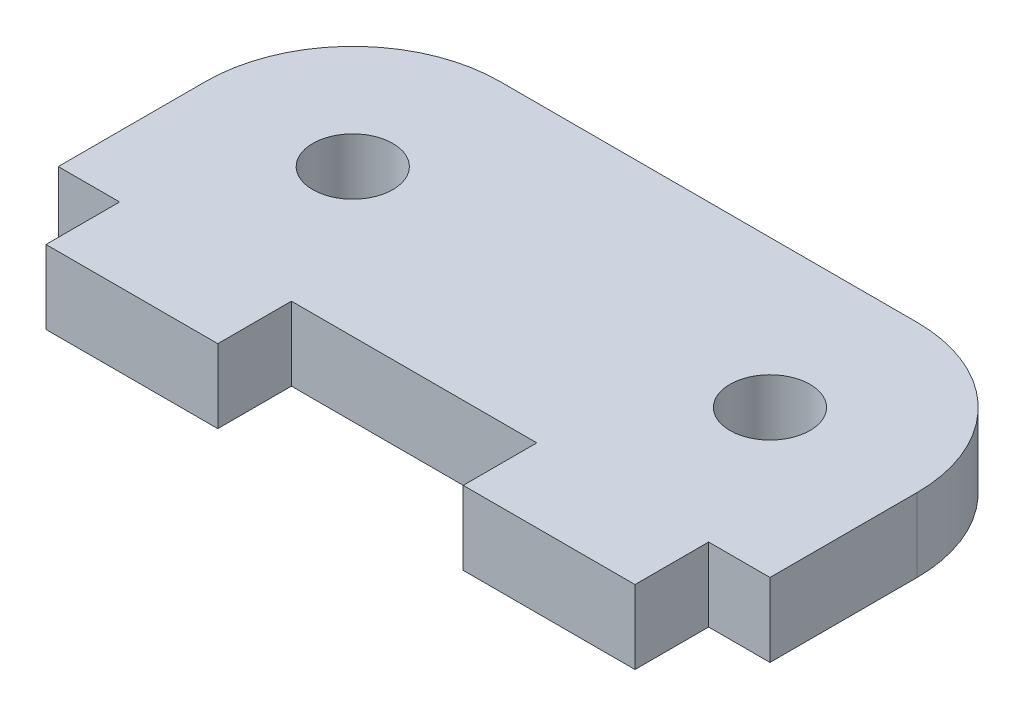
ISO-10303-21;
HEADER;
FILE_DESCRIPTION(('STEP AP214'),'2;1');
FILE_NAME('part.step','',(''),(''),'','','');
FILE_SCHEMA(('AUTOMOTIVE_DESIGN { 1 0 10303 214 1 1 1 1 }'));
ENDSEC;
DATA;
#1=APPLICATION_CONTEXT('core data for automotive mechanical design processes');
#2=APPLICATION_PROTOCOL_DEFINITION('international standard','automotive_design',2000,#1);
#3=PRODUCT_CONTEXT('',#1,'mechanical');
#4=PRODUCT('Part','Part','',(#3));
#5=PRODUCT_RELATED_PRODUCT_CATEGORY('part','',(#4));
#6=PRODUCT_DEFINITION_FORMATION('','',#4);
#7=PRODUCT_DEFINITION_CONTEXT('part definition',#1,'design');
#8=PRODUCT_DEFINITION('design','',#6,#7);
#9=PRODUCT_DEFINITION_SHAPE('','',#8);
#10=(LENGTH_UNIT() NAMED_UNIT(*) SI_UNIT(.MILLI.,.METRE.));
#11=(NAMED_UNIT(*) PLANE_ANGLE_UNIT() SI_UNIT($,.RADIAN.));
#12=(NAMED_UNIT(*) SI_UNIT($,.STERADIAN.) SOLID_ANGLE_UNIT());
#13=UNCERTAINTY_MEASURE_WITH_UNIT(LENGTH_MEASURE(1.E-05),#10,'distance_accuracy_value','');
#14=(GEOMETRIC_REPRESENTATION_CONTEXT(3) GLOBAL_UNCERTAINTY_ASSIGNED_CONTEXT((#13)) GLOBAL_UNIT_ASSIGNED_CONTEXT((#10,
#11,#12)) REPRESENTATION_CONTEXT('',''));
#15=CARTESIAN_POINT('',(0.,0.,0.));
#16=DIRECTION('',(0.,0.,1.));
#17=DIRECTION('',(1.,0.,0.));
#18=AXIS2_PLACEMENT_3D('',#15,#16,#17);
#19=CARTESIAN_POINT('',(0.,3.,-15.));
#20=DIRECTION('',(0.,0.,-1.));
#21=DIRECTION('',(-1.,0.,0.));
#22=AXIS2_PLACEMENT_3D('',#19,#20,#21);
#23=PLANE('',#22);
#24=DIRECTION('',(1.,0.,0.));
#25=VECTOR('',#24,1.);
#26=CARTESIAN_POINT('',(0.,0.,-15.));
#27=LINE('',#26,#25);
#28=CARTESIAN_POINT('',(3.49999999999999,0.,-15.));
#29=VERTEX_POINT('',#28);
#30=CARTESIAN_POINT('',(20.5,0.,-15.));
#31=VERTEX_POINT('',#30);
#32=EDGE_CURVE('E177',#29,#31,#27,.T.);
#33=ORIENTED_EDGE('',*,*,#32,.F.);
#34=DIRECTION('',(0.,-1.,0.));
#35=VECTOR('',#34,1.);
#36=CARTESIAN_POINT('',(3.49999999999999,3.,-15.));
#37=LINE('',#36,#35);
#38=CARTESIAN_POINT('',(3.49999999999999,3.,-15.));
#39=VERTEX_POINT('',#38);
#40=EDGE_CURVE('E11',#39,#29,#37,.T.);
#41=ORIENTED_EDGE('',*,*,#40,.F.);
#42=DIRECTION('',(1.,0.,0.));
#43=VECTOR('',#42,1.);
#44=CARTESIAN_POINT('',(0.,3.,-15.));
#45=LINE('',#44,#43);
#46=CARTESIAN_POINT('',(20.5,3.,-15.));
#47=VERTEX_POINT('',#46);
#48=EDGE_CURVE('E225',#39,#47,#45,.T.);
#49=ORIENTED_EDGE('',*,*,#48,.T.);
#50=DIRECTION('',(0.,-1.,0.));
#51=VECTOR('',#50,1.);
#52=CARTESIAN_POINT('',(20.5,3.,-15.));
#53=LINE('',#52,#51);
#54=EDGE_CURVE('E58',#47,#31,#53,.T.);
#55=ORIENTED_EDGE('',*,*,#54,.T.);
#56=EDGE_LOOP('',(#33,#41,#49,#55));
#57=FACE_BOUND('',#56,.T.);
#58=ADVANCED_FACE('F41',(#57),#23,.T.);
#59=CARTESIAN_POINT('',(3.5,3.,-9.));
#60=DIRECTION('',(0.,-1.,0.));
#61=DIRECTION('',(0.,0.,-1.));
#62=AXIS2_PLACEMENT_3D('',#59,#60,#61);
#63=CYLINDRICAL_SURFACE('',#62,6.);
#64=CARTESIAN_POINT('',(3.5,0.,-9.));
#65=DIRECTION('',(0.,1.,0.));
#66=DIRECTION('',(0.,0.,1.));
#67=AXIS2_PLACEMENT_3D('',#64,#65,#66);
#68=CIRCLE('',#67,6.);
#69=CARTESIAN_POINT('',(-2.5,0.,-9.));
#70=VERTEX_POINT('',#69);
#71=EDGE_CURVE('E180',#70,#29,#68,.F.);
#72=ORIENTED_EDGE('',*,*,#71,.F.);
#73=DIRECTION('',(0.,-1.,0.));
#74=VECTOR('',#73,1.);
#75=CARTESIAN_POINT('',(-2.5,3.,-9.));
#76=LINE('',#75,#74);
#77=CARTESIAN_POINT('',(-2.5,3.,-9.));
#78=VERTEX_POINT('',#77);
#79=EDGE_CURVE('E50',#78,#70,#76,.T.);
#80=ORIENTED_EDGE('',*,*,#79,.F.);
#81=CARTESIAN_POINT('',(3.5,3.,-9.));
#82=DIRECTION('',(0.,1.,0.));
#83=DIRECTION('',(0.,0.,1.));
#84=AXIS2_PLACEMENT_3D('',#81,#82,#83);
#85=CIRCLE('',#84,6.);
#86=EDGE_CURVE('E285',#78,#39,#85,.F.);
#87=ORIENTED_EDGE('',*,*,#86,.T.);
#88=ORIENTED_EDGE('',*,*,#40,.T.);
#89=EDGE_LOOP('',(#72,#80,#87,#88));
#90=FACE_BOUND('',#89,.T.);
#91=ADVANCED_FACE('F269',(#90),#63,.T.);
#92=CARTESIAN_POINT('',(-2.5,3.,0.));
#93=DIRECTION('',(-1.,0.,0.));
#94=DIRECTION('',(0.,0.,1.));
#95=AXIS2_PLACEMENT_3D('',#92,#93,#94);
#96=PLANE('',#95);
#97=DIRECTION('',(0.,0.,-1.));
#98=VECTOR('',#97,1.);
#99=CARTESIAN_POINT('',(-2.5,0.,0.));
#100=LINE('',#99,#98);
#101=CARTESIAN_POINT('',(-2.5,0.,-3.));
#102=VERTEX_POINT('',#101);
#103=EDGE_CURVE('E185',#102,#70,#100,.T.);
#104=ORIENTED_EDGE('',*,*,#103,.F.);
#105=DIRECTION('',(0.,-1.,0.));
#106=VECTOR('',#105,1.);
#107=CARTESIAN_POINT('',(-2.5,3.,-3.));
#108=LINE('',#107,#106);
#109=CARTESIAN_POINT('',(-2.5,3.,-3.));
#110=VERTEX_POINT('',#109);
#111=EDGE_CURVE('E256',#110,#102,#108,.T.);
#112=ORIENTED_EDGE('',*,*,#111,.F.);
#113=DIRECTION('',(0.,0.,-1.));
#114=VECTOR('',#113,1.);
#115=CARTESIAN_POINT('',(-2.5,3.,0.));
#116=LINE('',#115,#114);
#117=EDGE_CURVE('E265',#110,#78,#116,.T.);
#118=ORIENTED_EDGE('',*,*,#117,.T.);
#119=ORIENTED_EDGE('',*,*,#79,.T.);
#120=EDGE_LOOP('',(#104,#112,#118,#119));
#121=FACE_BOUND('',#120,.T.);
#122=ADVANCED_FACE('F263',(#121),#96,.T.);
#123=CARTESIAN_POINT('',(0.,3.,-3.));
#124=DIRECTION('',(0.,0.,-1.));
#125=DIRECTION('',(-1.,0.,0.));
#126=AXIS2_PLACEMENT_3D('',#123,#124,#125);
#127=PLANE('',#126);
#128=DIRECTION('',(1.,0.,0.));
#129=VECTOR('',#128,1.);
#130=CARTESIAN_POINT('',(0.,0.,-3.));
#131=LINE('',#130,#129);
#132=CARTESIAN_POINT('',(0.,0.,-3.));
#133=VERTEX_POINT('',#132);
#134=EDGE_CURVE('E189',#102,#133,#131,.T.);
#135=ORIENTED_EDGE('',*,*,#134,.T.);
#136=DIRECTION('',(0.,-1.,0.));
#137=VECTOR('',#136,1.);
#138=CARTESIAN_POINT('',(0.,3.,-3.));
#139=LINE('',#138,#137);
#140=CARTESIAN_POINT('',(0.,3.,-3.));
#141=VERTEX_POINT('',#140);
#142=EDGE_CURVE('E253',#141,#133,#139,.T.);
#143=ORIENTED_EDGE('',*,*,#142,.F.);
#144=DIRECTION('',(1.,0.,0.));
#145=VECTOR('',#144,1.);
#146=CARTESIAN_POINT('',(0.,3.,-3.));
#147=LINE('',#146,#145);
#148=EDGE_CURVE('E280',#110,#141,#147,.T.);
#149=ORIENTED_EDGE('',*,*,#148,.F.);
#150=ORIENTED_EDGE('',*,*,#111,.T.);
#151=EDGE_LOOP('',(#135,#143,#149,#150));
#152=FACE_BOUND('',#151,.T.);
#153=ADVANCED_FACE('F277',(#152),#127,.F.);
#154=CARTESIAN_POINT('',(0.,3.,0.));
#155=DIRECTION('',(-1.,0.,0.));
#156=DIRECTION('',(0.,0.,1.));
#157=AXIS2_PLACEMENT_3D('',#154,#155,#156);
#158=PLANE('',#157);
#159=DIRECTION('',(0.,0.,-1.));
#160=VECTOR('',#159,1.);
#161=CARTESIAN_POINT('',(0.,0.,0.));
#162=LINE('',#161,#160);
#163=CARTESIAN_POINT('',(0.,0.,0.));
#164=VERTEX_POINT('',#163);
#165=EDGE_CURVE('E193',#164,#133,#162,.T.);
#166=ORIENTED_EDGE('',*,*,#165,.F.);
#167=DIRECTION('',(0.,-1.,0.));
#168=VECTOR('',#167,1.);
#169=CARTESIAN_POINT('',(0.,3.,0.));
#170=LINE('',#169,#168);
#171=CARTESIAN_POINT('',(0.,3.,0.));
#172=VERTEX_POINT('',#171);
#173=EDGE_CURVE('E250',#172,#164,#170,.T.);
#174=ORIENTED_EDGE('',*,*,#173,.F.);
#175=DIRECTION('',(0.,0.,-1.));
#176=VECTOR('',#175,1.);
#177=CARTESIAN_POINT('',(0.,3.,0.));
#178=LINE('',#177,#176);
#179=EDGE_CURVE('E283',#172,#141,#178,.T.);
#180=ORIENTED_EDGE('',*,*,#179,.T.);
#181=ORIENTED_EDGE('',*,*,#142,.T.);
#182=EDGE_LOOP('',(#166,#174,#180,#181));
#183=FACE_BOUND('',#182,.T.);
#184=ADVANCED_FACE('F353',(#183),#158,.T.);
#185=CARTESIAN_POINT('',(0.,3.,0.));
#186=DIRECTION('',(0.,0.,-1.));
#187=DIRECTION('',(-1.,0.,0.));
#188=AXIS2_PLACEMENT_3D('',#185,#186,#187);
#189=PLANE('',#188);
#190=DIRECTION('',(1.,0.,0.));
#191=VECTOR('',#190,1.);
#192=CARTESIAN_POINT('',(0.,0.,0.));
#193=LINE('',#192,#191);
#194=CARTESIAN_POINT('',(7.,0.,0.));
#195=VERTEX_POINT('',#194);
#196=EDGE_CURVE('E197',#164,#195,#193,.T.);
#197=ORIENTED_EDGE('',*,*,#196,.T.);
#198=DIRECTION('',(0.,-1.,0.));
#199=VECTOR('',#198,1.);
#200=CARTESIAN_POINT('',(7.,3.,0.));
#201=LINE('',#200,#199);
#202=CARTESIAN_POINT('',(7.,3.,0.));
#203=VERTEX_POINT('',#202);
#204=EDGE_CURVE('E246',#203,#195,#201,.T.);
#205=ORIENTED_EDGE('',*,*,#204,.F.);
#206=DIRECTION('',(1.,0.,0.));
#207=VECTOR('',#206,1.);
#208=CARTESIAN_POINT('',(0.,3.,0.));
#209=LINE('',#208,#207);
#210=EDGE_CURVE('E294',#172,#203,#209,.T.);
#211=ORIENTED_EDGE('',*,*,#210,.F.);
#212=ORIENTED_EDGE('',*,*,#173,.T.);
#213=EDGE_LOOP('',(#197,#205,#211,#212));
#214=FACE_BOUND('',#213,.T.);
#215=ADVANCED_FACE('F356',(#214),#189,.F.);
#216=CARTESIAN_POINT('',(7.,3.,0.));
#217=DIRECTION('',(-1.,0.,0.));
#218=DIRECTION('',(0.,0.,1.));
#219=AXIS2_PLACEMENT_3D('',#216,#217,#218);
#220=PLANE('',#219);
#221=DIRECTION('',(0.,0.,-1.));
#222=VECTOR('',#221,1.);
#223=CARTESIAN_POINT('',(7.,0.,0.));
#224=LINE('',#223,#222);
#225=CARTESIAN_POINT('',(7.,0.,-3.));
#226=VERTEX_POINT('',#225);
#227=EDGE_CURVE('E200',#195,#226,#224,.T.);
#228=ORIENTED_EDGE('',*,*,#227,.T.);
#229=DIRECTION('',(0.,-1.,0.));
#230=VECTOR('',#229,1.);
#231=CARTESIAN_POINT('',(7.,3.,-3.));
#232=LINE('',#231,#230);
#233=CARTESIAN_POINT('',(7.,3.,-3.));
#234=VERTEX_POINT('',#233);
#235=EDGE_CURVE('E242',#234,#226,#232,.T.);
#236=ORIENTED_EDGE('',*,*,#235,.F.);
#237=DIRECTION('',(0.,0.,-1.));
#238=VECTOR('',#237,1.);
#239=CARTESIAN_POINT('',(7.,3.,0.));
#240=LINE('',#239,#238);
#241=EDGE_CURVE('E297',#203,#234,#240,.T.);
#242=ORIENTED_EDGE('',*,*,#241,.F.);
#243=ORIENTED_EDGE('',*,*,#204,.T.);
#244=EDGE_LOOP('',(#228,#236,#242,#243));
#245=FACE_BOUND('',#244,.T.);
#246=ADVANCED_FACE('F360',(#245),#220,.F.);
#247=CARTESIAN_POINT('',(0.,3.,-3.));
#248=DIRECTION('',(0.,0.,-1.));
#249=DIRECTION('',(-1.,0.,0.));
#250=AXIS2_PLACEMENT_3D('',#247,#248,#249);
#251=PLANE('',#250);
#252=DIRECTION('',(1.,0.,0.));
#253=VECTOR('',#252,1.);
#254=CARTESIAN_POINT('',(0.,0.,-3.));
#255=LINE('',#254,#253);
#256=CARTESIAN_POINT('',(17.,0.,-3.));
#257=VERTEX_POINT('',#256);
#258=EDGE_CURVE('E203',#226,#257,#255,.T.);
#259=ORIENTED_EDGE('',*,*,#258,.T.);
#260=DIRECTION('',(0.,-1.,0.));
#261=VECTOR('',#260,1.);
#262=CARTESIAN_POINT('',(17.,3.,-3.));
#263=LINE('',#262,#261);
#264=CARTESIAN_POINT('',(17.,3.,-3.));
#265=VERTEX_POINT('',#264);
#266=EDGE_CURVE('E238',#265,#257,#263,.T.);
#267=ORIENTED_EDGE('',*,*,#266,.F.);
#268=DIRECTION('',(1.,0.,0.));
#269=VECTOR('',#268,1.);
#270=CARTESIAN_POINT('',(0.,3.,-3.));
#271=LINE('',#270,#269);
#272=EDGE_CURVE('E157',#234,#265,#271,.T.);
#273=ORIENTED_EDGE('',*,*,#272,.F.);
#274=ORIENTED_EDGE('',*,*,#235,.T.);
#275=EDGE_LOOP('',(#259,#267,#273,#274));
#276=FACE_BOUND('',#275,.T.);
#277=ADVANCED_FACE('F364',(#276),#251,.F.);
#278=CARTESIAN_POINT('',(17.,3.,0.));
#279=DIRECTION('',(1.,0.,0.));
#280=DIRECTION('',(0.,0.,-1.));
#281=AXIS2_PLACEMENT_3D('',#278,#279,#280);
#282=PLANE('',#281);
#283=DIRECTION('',(0.,0.,1.));
#284=VECTOR('',#283,1.);
#285=CARTESIAN_POINT('',(17.,0.,0.));
#286=LINE('',#285,#284);
#287=CARTESIAN_POINT('',(17.,0.,0.));
#288=VERTEX_POINT('',#287);
#289=EDGE_CURVE('E206',#257,#288,#286,.T.);
#290=ORIENTED_EDGE('',*,*,#289,.T.);
#291=DIRECTION('',(0.,-1.,0.));
#292=VECTOR('',#291,1.);
#293=CARTESIAN_POINT('',(17.,3.,0.));
#294=LINE('',#293,#292);
#295=CARTESIAN_POINT('',(17.,3.,0.));
#296=VERTEX_POINT('',#295);
#297=EDGE_CURVE('E235',#296,#288,#294,.T.);
#298=ORIENTED_EDGE('',*,*,#297,.F.);
#299=DIRECTION('',(0.,0.,1.));
#300=VECTOR('',#299,1.);
#301=CARTESIAN_POINT('',(17.,3.,0.));
#302=LINE('',#301,#300);
#303=EDGE_CURVE('E301',#265,#296,#302,.T.);
#304=ORIENTED_EDGE('',*,*,#303,.F.);
#305=ORIENTED_EDGE('',*,*,#266,.T.);
#306=EDGE_LOOP('',(#290,#298,#304,#305));
#307=FACE_BOUND('',#306,.T.);
#308=ADVANCED_FACE('F366',(#307),#282,.F.);
#309=CARTESIAN_POINT('',(0.,3.,0.));
#310=DIRECTION('',(0.,0.,1.));
#311=DIRECTION('',(1.,0.,0.));
#312=AXIS2_PLACEMENT_3D('',#309,#310,#311);
#313=PLANE('',#312);
#314=DIRECTION('',(-1.,0.,0.));
#315=VECTOR('',#314,1.);
#316=CARTESIAN_POINT('',(0.,0.,0.));
#317=LINE('',#316,#315);
#318=CARTESIAN_POINT('',(24.,0.,0.));
#319=VERTEX_POINT('',#318);
#320=EDGE_CURVE('E210',#319,#288,#317,.T.);
#321=ORIENTED_EDGE('',*,*,#320,.F.);
#322=DIRECTION('',(0.,-1.,0.));
#323=VECTOR('',#322,1.);
#324=CARTESIAN_POINT('',(24.,3.,0.));
#325=LINE('',#324,#323);
#326=CARTESIAN_POINT('',(24.,3.,0.));
#327=VERTEX_POINT('',#326);
#328=EDGE_CURVE('E232',#327,#319,#325,.T.);
#329=ORIENTED_EDGE('',*,*,#328,.F.);
#330=DIRECTION('',(-1.,0.,0.));
#331=VECTOR('',#330,1.);
#332=CARTESIAN_POINT('',(0.,3.,0.));
#333=LINE('',#332,#331);
#334=EDGE_CURVE('E303',#327,#296,#333,.T.);
#335=ORIENTED_EDGE('',*,*,#334,.T.);
#336=ORIENTED_EDGE('',*,*,#297,.T.);
#337=EDGE_LOOP('',(#321,#329,#335,#336));
#338=FACE_BOUND('',#337,.T.);
#339=ADVANCED_FACE('F369',(#338),#313,.T.);
#340=CARTESIAN_POINT('',(24.,3.,0.));
#341=DIRECTION('',(1.,0.,0.));
#342=DIRECTION('',(0.,0.,-1.));
#343=AXIS2_PLACEMENT_3D('',#340,#341,#342);
#344=PLANE('',#343);
#345=DIRECTION('',(0.,0.,1.));
#346=VECTOR('',#345,1.);
#347=CARTESIAN_POINT('',(24.,0.,0.));
#348=LINE('',#347,#346);
#349=CARTESIAN_POINT('',(24.,0.,-3.));
#350=VERTEX_POINT('',#349);
#351=EDGE_CURVE('E214',#350,#319,#348,.T.);
#352=ORIENTED_EDGE('',*,*,#351,.F.);
#353=DIRECTION('',(0.,-1.,0.));
#354=VECTOR('',#353,1.);
#355=CARTESIAN_POINT('',(24.,3.,-3.));
#356=LINE('',#355,#354);
#357=CARTESIAN_POINT('',(24.,3.,-3.));
#358=VERTEX_POINT('',#357);
#359=EDGE_CURVE('E166',#358,#350,#356,.T.);
#360=ORIENTED_EDGE('',*,*,#359,.F.);
#361=DIRECTION('',(0.,0.,1.));
#362=VECTOR('',#361,1.);
#363=CARTESIAN_POINT('',(24.,3.,0.));
#364=LINE('',#363,#362);
#365=EDGE_CURVE('E153',#358,#327,#364,.T.);
#366=ORIENTED_EDGE('',*,*,#365,.T.);
#367=ORIENTED_EDGE('',*,*,#328,.T.);
#368=EDGE_LOOP('',(#352,#360,#366,#367));
#369=FACE_BOUND('',#368,.T.);
#370=ADVANCED_FACE('F310',(#369),#344,.T.);
#371=CARTESIAN_POINT('',(26.5,0.,-3.));
#372=VERTEX_POINT('',#371);
#373=EDGE_CURVE('E162',#350,#372,#255,.T.);
#374=ORIENTED_EDGE('',*,*,#373,.T.);
#375=DIRECTION('',(0.,-1.,0.));
#376=VECTOR('',#375,1.);
#377=CARTESIAN_POINT('',(26.5,3.,-3.));
#378=LINE('',#377,#376);
#379=CARTESIAN_POINT('',(26.5,3.,-3.));
#380=VERTEX_POINT('',#379);
#381=EDGE_CURVE('E159',#380,#372,#378,.T.);
#382=ORIENTED_EDGE('',*,*,#381,.F.);
#383=EDGE_CURVE('E145',#358,#380,#271,.T.);
#384=ORIENTED_EDGE('',*,*,#383,.F.);
#385=ORIENTED_EDGE('',*,*,#359,.T.);
#386=EDGE_LOOP('',(#374,#382,#384,#385));
#387=FACE_BOUND('',#386,.T.);
#388=ADVANCED_FACE('F160',(#387),#251,.F.);
#389=CARTESIAN_POINT('',(26.5,3.,0.));
#390=DIRECTION('',(-1.,0.,0.));
#391=DIRECTION('',(0.,0.,1.));
#392=AXIS2_PLACEMENT_3D('',#389,#390,#391);
#393=PLANE('',#392);
#394=DIRECTION('',(0.,0.,-1.));
#395=VECTOR('',#394,1.);
#396=CARTESIAN_POINT('',(26.5,0.,0.));
#397=LINE('',#396,#395);
#398=CARTESIAN_POINT('',(26.5,0.,-9.));
#399=VERTEX_POINT('',#398);
#400=EDGE_CURVE('E218',#372,#399,#397,.T.);
#401=ORIENTED_EDGE('',*,*,#400,.T.);
#402=DIRECTION('',(0.,-1.,0.));
#403=VECTOR('',#402,1.);
#404=CARTESIAN_POINT('',(26.5,3.,-9.));
#405=LINE('',#404,#403);
#406=CARTESIAN_POINT('',(26.5,3.,-9.));
#407=VERTEX_POINT('',#406);
#408=EDGE_CURVE('E102',#407,#399,#405,.T.);
#409=ORIENTED_EDGE('',*,*,#408,.F.);
#410=DIRECTION('',(0.,0.,-1.));
#411=VECTOR('',#410,1.);
#412=CARTESIAN_POINT('',(26.5,3.,0.));
#413=LINE('',#412,#411);
#414=EDGE_CURVE('E150',#380,#407,#413,.T.);
#415=ORIENTED_EDGE('',*,*,#414,.F.);
#416=ORIENTED_EDGE('',*,*,#381,.T.);
#417=EDGE_LOOP('',(#401,#409,#415,#416));
#418=FACE_BOUND('',#417,.T.);
#419=ADVANCED_FACE('F168',(#418),#393,.F.);
#420=CARTESIAN_POINT('',(20.5,3.,-9.));
#421=DIRECTION('',(0.,-1.,0.));
#422=DIRECTION('',(0.,0.,-1.));
#423=AXIS2_PLACEMENT_3D('',#420,#421,#422);
#424=CYLINDRICAL_SURFACE('',#423,6.);
#425=CARTESIAN_POINT('',(20.5,0.,-9.));
#426=DIRECTION('',(0.,1.,0.));
#427=DIRECTION('',(0.,0.,1.));
#428=AXIS2_PLACEMENT_3D('',#425,#426,#427);
#429=CIRCLE('',#428,6.);
#430=EDGE_CURVE('E221',#31,#399,#429,.F.);
#431=ORIENTED_EDGE('',*,*,#430,.F.);
#432=ORIENTED_EDGE('',*,*,#54,.F.);
#433=CARTESIAN_POINT('',(20.5,3.,-9.));
#434=DIRECTION('',(0.,1.,0.));
#435=DIRECTION('',(0.,0.,1.));
#436=AXIS2_PLACEMENT_3D('',#433,#434,#435);
#437=CIRCLE('',#436,6.);
#438=EDGE_CURVE('E170',#47,#407,#437,.F.);
#439=ORIENTED_EDGE('',*,*,#438,.T.);
#440=ORIENTED_EDGE('',*,*,#408,.T.);
#441=EDGE_LOOP('',(#431,#432,#439,#440));
#442=FACE_BOUND('',#441,.T.);
#443=ADVANCED_FACE('F331',(#442),#424,.T.);
#444=CARTESIAN_POINT('',(0.,3.,0.));
#445=DIRECTION('',(0.,1.,0.));
#446=DIRECTION('',(0.,0.,1.));
#447=AXIS2_PLACEMENT_3D('',#444,#445,#446);
#448=PLANE('',#447);
#449=CARTESIAN_POINT('',(3.5,3.,-9.));
#450=DIRECTION('',(0.,1.,0.));
#451=DIRECTION('',(0.,0.,1.));
#452=AXIS2_PLACEMENT_3D('',#449,#450,#451);
#453=CIRCLE('',#452,1.63195);
#454=CARTESIAN_POINT('',(3.5,3.,-7.36805));
#455=VERTEX_POINT('',#454);
#456=EDGE_CURVE('E324',#455,#455,#453,.T.);
#457=ORIENTED_EDGE('',*,*,#456,.F.);
#458=EDGE_LOOP('',(#457));
#459=FACE_BOUND('',#458,.T.);
#460=CARTESIAN_POINT('',(20.5,3.,-9.));
#461=DIRECTION('',(0.,1.,0.));
#462=DIRECTION('',(0.,0.,1.));
#463=AXIS2_PLACEMENT_3D('',#460,#461,#462);
#464=CIRCLE('',#463,1.63195);
#465=CARTESIAN_POINT('',(20.5,3.,-7.36805));
#466=VERTEX_POINT('',#465);
#467=EDGE_CURVE('E316',#466,#466,#464,.T.);
#468=ORIENTED_EDGE('',*,*,#467,.F.);
#469=EDGE_LOOP('',(#468));
#470=FACE_BOUND('',#469,.T.);
#471=ORIENTED_EDGE('',*,*,#48,.F.);
#472=ORIENTED_EDGE('',*,*,#86,.F.);
#473=ORIENTED_EDGE('',*,*,#117,.F.);
#474=ORIENTED_EDGE('',*,*,#148,.T.);
#475=ORIENTED_EDGE('',*,*,#179,.F.);
#476=ORIENTED_EDGE('',*,*,#210,.T.);
#477=ORIENTED_EDGE('',*,*,#241,.T.);
#478=ORIENTED_EDGE('',*,*,#272,.T.);
#479=ORIENTED_EDGE('',*,*,#303,.T.);
#480=ORIENTED_EDGE('',*,*,#334,.F.);
#481=ORIENTED_EDGE('',*,*,#365,.F.);
#482=ORIENTED_EDGE('',*,*,#383,.T.);
#483=ORIENTED_EDGE('',*,*,#414,.T.);
#484=ORIENTED_EDGE('',*,*,#438,.F.);
#485=EDGE_LOOP('',(#471,#472,#473,#474,#475,#476,#477,#478,#479,#480,#481,#482,#483,#484));
#486=FACE_BOUND('',#485,.T.);
#487=ADVANCED_FACE('F147',(#459,#470,#486),#448,.T.);
#488=CARTESIAN_POINT('',(0.,0.,0.));
#489=DIRECTION('',(0.,1.,0.));
#490=DIRECTION('',(0.,0.,1.));
#491=AXIS2_PLACEMENT_3D('',#488,#489,#490);
#492=PLANE('',#491);
#493=CARTESIAN_POINT('',(3.5,0.,-9.));
#494=DIRECTION('',(0.,1.,0.));
#495=DIRECTION('',(0.,0.,1.));
#496=AXIS2_PLACEMENT_3D('',#493,#494,#495);
#497=CIRCLE('',#496,1.63195);
#498=CARTESIAN_POINT('',(3.5,0.,-7.36805));
#499=VERTEX_POINT('',#498);
#500=EDGE_CURVE('E320',#499,#499,#497,.T.);
#501=ORIENTED_EDGE('',*,*,#500,.T.);
#502=EDGE_LOOP('',(#501));
#503=FACE_BOUND('',#502,.T.);
#504=CARTESIAN_POINT('',(20.5,0.,-9.));
#505=DIRECTION('',(0.,1.,0.));
#506=DIRECTION('',(0.,0.,1.));
#507=AXIS2_PLACEMENT_3D('',#504,#505,#506);
#508=CIRCLE('',#507,1.63195);
#509=CARTESIAN_POINT('',(20.5,0.,-7.36805));
#510=VERTEX_POINT('',#509);
#511=EDGE_CURVE('E181',#510,#510,#508,.T.);
#512=ORIENTED_EDGE('',*,*,#511,.T.);
#513=EDGE_LOOP('',(#512));
#514=FACE_BOUND('',#513,.T.);
#515=ORIENTED_EDGE('',*,*,#32,.T.);
#516=ORIENTED_EDGE('',*,*,#430,.T.);
#517=ORIENTED_EDGE('',*,*,#400,.F.);
#518=ORIENTED_EDGE('',*,*,#373,.F.);
#519=ORIENTED_EDGE('',*,*,#351,.T.);
#520=ORIENTED_EDGE('',*,*,#320,.T.);
#521=ORIENTED_EDGE('',*,*,#289,.F.);
#522=ORIENTED_EDGE('',*,*,#258,.F.);
#523=ORIENTED_EDGE('',*,*,#227,.F.);
#524=ORIENTED_EDGE('',*,*,#196,.F.);
#525=ORIENTED_EDGE('',*,*,#165,.T.);
#526=ORIENTED_EDGE('',*,*,#134,.F.);
#527=ORIENTED_EDGE('',*,*,#103,.T.);
#528=ORIENTED_EDGE('',*,*,#71,.T.);
#529=EDGE_LOOP('',(#515,#516,#517,#518,#519,#520,#521,#522,#523,#524,#525,#526,#527,#528));
#530=FACE_BOUND('',#529,.T.);
#531=ADVANCED_FACE('F272',(#503,#514,#530),#492,.F.);
#532=CARTESIAN_POINT('',(20.5,3.,-9.));
#533=DIRECTION('',(0.,1.,0.));
#534=DIRECTION('',(0.,0.,1.));
#535=AXIS2_PLACEMENT_3D('',#532,#533,#534);
#536=CYLINDRICAL_SURFACE('',#535,1.63195);
#537=ORIENTED_EDGE('',*,*,#511,.F.);
#538=EDGE_LOOP('',(#537));
#539=FACE_BOUND('',#538,.T.);
#540=ORIENTED_EDGE('',*,*,#467,.T.);
#541=EDGE_LOOP('',(#540));
#542=FACE_BOUND('',#541,.T.);
#543=ADVANCED_FACE('F441',(#539,#542),#536,.F.);
#544=CARTESIAN_POINT('',(3.5,3.,-9.));
#545=DIRECTION('',(0.,1.,0.));
#546=DIRECTION('',(0.,0.,1.));
#547=AXIS2_PLACEMENT_3D('',#544,#545,#546);
#548=CYLINDRICAL_SURFACE('',#547,1.63195);
#549=ORIENTED_EDGE('',*,*,#500,.F.);
#550=EDGE_LOOP('',(#549));
#551=FACE_BOUND('',#550,.T.);
#552=ORIENTED_EDGE('',*,*,#456,.T.);
#553=EDGE_LOOP('',(#552));
#554=FACE_BOUND('',#553,.T.);
#555=ADVANCED_FACE('F451',(#551,#554),#548,.F.);
#556=CLOSED_SHELL('',(#58,#91,#122,#153,#184,#215,#246,#277,#308,#339,#370,#388,#419,#443,#487,
#531,#543,#555));
#557=MANIFOLD_SOLID_BREP('B2',#556);
#558=ADVANCED_BREP_SHAPE_REPRESENTATION('',(#18,#557),#14);
#559=SHAPE_DEFINITION_REPRESENTATION(#9,#558);
ENDSEC;
END-ISO-10303-21;
